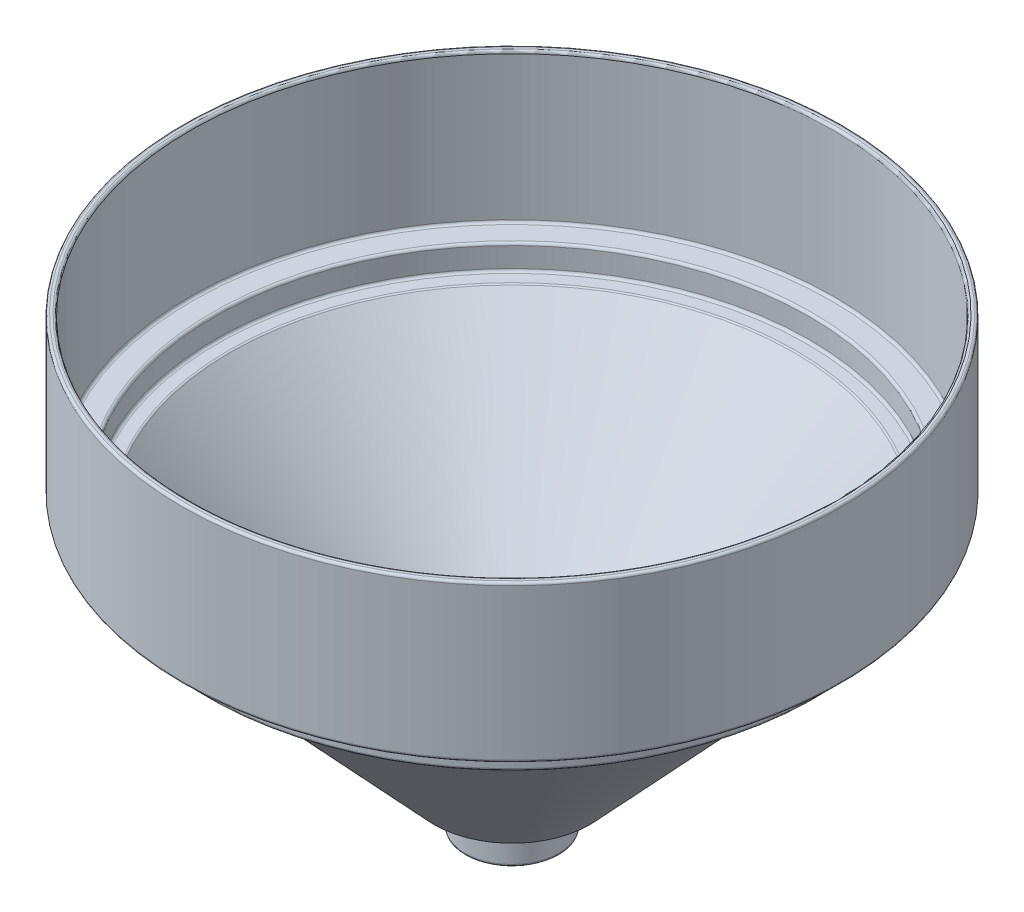
ISO-10303-21;
HEADER;
FILE_DESCRIPTION(('STEP AP214'),'2;1');
FILE_NAME('part.step','',(''),(''),'','','');
FILE_SCHEMA(('AUTOMOTIVE_DESIGN { 1 0 10303 214 1 1 1 1 }'));
ENDSEC;
DATA;
#1=APPLICATION_CONTEXT('core data for automotive mechanical design processes');
#2=APPLICATION_PROTOCOL_DEFINITION('international standard','automotive_design',2000,#1);
#3=PRODUCT_CONTEXT('',#1,'mechanical');
#4=PRODUCT('Part','Part','',(#3));
#5=PRODUCT_RELATED_PRODUCT_CATEGORY('part','',(#4));
#6=PRODUCT_DEFINITION_FORMATION('','',#4);
#7=PRODUCT_DEFINITION_CONTEXT('part definition',#1,'design');
#8=PRODUCT_DEFINITION('design','',#6,#7);
#9=PRODUCT_DEFINITION_SHAPE('','',#8);
#10=(LENGTH_UNIT() NAMED_UNIT(*) SI_UNIT(.MILLI.,.METRE.));
#11=(NAMED_UNIT(*) PLANE_ANGLE_UNIT() SI_UNIT($,.RADIAN.));
#12=(NAMED_UNIT(*) SI_UNIT($,.STERADIAN.) SOLID_ANGLE_UNIT());
#13=UNCERTAINTY_MEASURE_WITH_UNIT(LENGTH_MEASURE(1.E-05),#10,'distance_accuracy_value','');
#14=(GEOMETRIC_REPRESENTATION_CONTEXT(3) GLOBAL_UNCERTAINTY_ASSIGNED_CONTEXT((#13)) GLOBAL_UNIT_ASSIGNED_CONTEXT((#10,
#11,#12)) REPRESENTATION_CONTEXT('',''));
#15=CARTESIAN_POINT('',(0.,0.,0.));
#16=DIRECTION('',(0.,0.,1.));
#17=DIRECTION('',(1.,0.,0.));
#18=AXIS2_PLACEMENT_3D('',#15,#16,#17);
#19=CARTESIAN_POINT('',(0.,0.,0.));
#20=DIRECTION('',(0.,-1.,0.));
#21=DIRECTION('',(0.,0.,-1.));
#22=AXIS2_PLACEMENT_3D('',#19,#20,#21);
#23=CYLINDRICAL_SURFACE('',#22,66.5);
#24=CARTESIAN_POINT('',(0.,79.5,0.));
#25=DIRECTION('',(0.,-1.,0.));
#26=DIRECTION('',(0.,0.,-1.));
#27=AXIS2_PLACEMENT_3D('',#24,#25,#26);
#28=CIRCLE('',#27,66.5);
#29=CARTESIAN_POINT('',(0.,79.5,-66.5000000000003));
#30=VERTEX_POINT('',#29);
#31=EDGE_CURVE('E75',#30,#30,#28,.T.);
#32=ORIENTED_EDGE('',*,*,#31,.T.);
#33=EDGE_LOOP('',(#32));
#34=FACE_BOUND('',#33,.T.);
#35=CARTESIAN_POINT('',(0.,49.,0.));
#36=DIRECTION('',(0.,-1.,0.));
#37=DIRECTION('',(0.,0.,-1.));
#38=AXIS2_PLACEMENT_3D('',#35,#36,#37);
#39=CIRCLE('',#38,66.5);
#40=CARTESIAN_POINT('',(0.,49.,-66.5000000000003));
#41=VERTEX_POINT('',#40);
#42=EDGE_CURVE('E78',#41,#41,#39,.F.);
#43=ORIENTED_EDGE('',*,*,#42,.T.);
#44=EDGE_LOOP('',(#43));
#45=FACE_BOUND('',#44,.T.);
#46=ADVANCED_FACE('F49',(#34,#45),#23,.T.);
#47=CARTESIAN_POINT('',(0.,48.5,-60.));
#48=DIRECTION('',(0.,-1.,0.));
#49=DIRECTION('',(0.,0.,-1.));
#50=AXIS2_PLACEMENT_3D('',#47,#48,#49);
#51=PLANE('',#50);
#52=CARTESIAN_POINT('',(0.,48.5,0.));
#53=DIRECTION('',(0.,-1.,0.));
#54=DIRECTION('',(0.,0.,-1.));
#55=AXIS2_PLACEMENT_3D('',#52,#53,#54);
#56=CIRCLE('',#55,62.);
#57=CARTESIAN_POINT('',(0.,48.5,-62.0000000000002));
#58=VERTEX_POINT('',#57);
#59=EDGE_CURVE('E12',#58,#58,#56,.F.);
#60=ORIENTED_EDGE('',*,*,#59,.T.);
#61=EDGE_LOOP('',(#60));
#62=FACE_BOUND('',#61,.T.);
#63=CARTESIAN_POINT('',(0.,48.5,0.));
#64=DIRECTION('',(0.,-1.,0.));
#65=DIRECTION('',(0.,0.,-1.));
#66=AXIS2_PLACEMENT_3D('',#63,#64,#65);
#67=CIRCLE('',#66,66.);
#68=CARTESIAN_POINT('',(0.,48.5,-66.0000000000003));
#69=VERTEX_POINT('',#68);
#70=EDGE_CURVE('E56',#69,#69,#67,.T.);
#71=ORIENTED_EDGE('',*,*,#70,.T.);
#72=EDGE_LOOP('',(#71));
#73=FACE_BOUND('',#72,.T.);
#74=ADVANCED_FACE('F192',(#62,#73),#51,.T.);
#75=CARTESIAN_POINT('',(0.,0.,0.));
#76=DIRECTION('',(0.,-1.,0.));
#77=DIRECTION('',(0.,0.,-1.));
#78=AXIS2_PLACEMENT_3D('',#75,#76,#77);
#79=CYLINDRICAL_SURFACE('',#78,61.5);
#80=CARTESIAN_POINT('',(0.,48.,0.));
#81=DIRECTION('',(0.,-1.,0.));
#82=DIRECTION('',(0.,0.,-1.));
#83=AXIS2_PLACEMENT_3D('',#80,#81,#82);
#84=CIRCLE('',#83,61.5);
#85=CARTESIAN_POINT('',(0.,48.,-61.5000000000002));
#86=VERTEX_POINT('',#85);
#87=EDGE_CURVE('E60',#86,#86,#84,.T.);
#88=ORIENTED_EDGE('',*,*,#87,.T.);
#89=EDGE_LOOP('',(#88));
#90=FACE_BOUND('',#89,.T.);
#91=CARTESIAN_POINT('',(0.,44.,0.));
#92=DIRECTION('',(0.,-1.,0.));
#93=DIRECTION('',(0.,0.,-1.));
#94=AXIS2_PLACEMENT_3D('',#91,#92,#93);
#95=CIRCLE('',#94,61.5);
#96=CARTESIAN_POINT('',(0.,44.,-61.5000000000002));
#97=VERTEX_POINT('',#96);
#98=EDGE_CURVE('E64',#97,#97,#95,.F.);
#99=ORIENTED_EDGE('',*,*,#98,.T.);
#100=EDGE_LOOP('',(#99));
#101=FACE_BOUND('',#100,.T.);
#102=ADVANCED_FACE('F250',(#90,#101),#79,.T.);
#103=CARTESIAN_POINT('',(0.,43.5,-57.));
#104=DIRECTION('',(0.,-1.,0.));
#105=DIRECTION('',(0.,0.,-1.));
#106=AXIS2_PLACEMENT_3D('',#103,#104,#105);
#107=PLANE('',#106);
#108=CARTESIAN_POINT('',(0.,43.5,0.));
#109=DIRECTION('',(0.,-1.,0.));
#110=DIRECTION('',(0.,0.,-1.));
#111=AXIS2_PLACEMENT_3D('',#108,#109,#110);
#112=CIRCLE('',#111,57.8691046038244);
#113=CARTESIAN_POINT('',(0.,43.5,-57.8691046038247));
#114=VERTEX_POINT('',#113);
#115=EDGE_CURVE('E69',#114,#114,#112,.F.);
#116=ORIENTED_EDGE('',*,*,#115,.T.);
#117=EDGE_LOOP('',(#116));
#118=FACE_BOUND('',#117,.T.);
#119=CARTESIAN_POINT('',(0.,43.5,0.));
#120=DIRECTION('',(0.,-1.,0.));
#121=DIRECTION('',(0.,0.,-1.));
#122=AXIS2_PLACEMENT_3D('',#119,#120,#121);
#123=CIRCLE('',#122,61.);
#124=CARTESIAN_POINT('',(0.,43.5,-61.0000000000002));
#125=VERTEX_POINT('',#124);
#126=EDGE_CURVE('E72',#125,#125,#123,.T.);
#127=ORIENTED_EDGE('',*,*,#126,.T.);
#128=EDGE_LOOP('',(#127));
#129=FACE_BOUND('',#128,.T.);
#130=ADVANCED_FACE('F253',(#118,#129),#107,.T.);
#131=CARTESIAN_POINT('',(0.,-1.5,0.));
#132=DIRECTION('',(0.,1.,0.));
#133=DIRECTION('',(0.,0.,1.));
#134=AXIS2_PLACEMENT_3D('',#131,#132,#133);
#135=CONICAL_SURFACE('',#134,15.6518284528683,0.75092906239794);
#136=CARTESIAN_POINT('',(0.,-1.34115912518001,0.));
#137=DIRECTION('',(0.,-1.,0.));
#138=DIRECTION('',(0.,0.,-1.));
#139=AXIS2_PLACEMENT_3D('',#136,#137,#138);
#140=CIRCLE('',#139,15.8000799360336);
#141=CARTESIAN_POINT('',(0.,-1.34115912518001,15.8000799360337));
#142=VERTEX_POINT('',#141);
#143=EDGE_CURVE('E87',#142,#142,#140,.F.);
#144=CARTESIAN_POINT('',(0.,43.34115912518,0.));
#145=DIRECTION('',(0.,1.,0.));
#146=DIRECTION('',(0.,0.,1.));
#147=AXIS2_PLACEMENT_3D('',#144,#145,#146);
#148=CIRCLE('',#147,57.503576969703);
#149=CARTESIAN_POINT('',(0.,43.34115912518,57.5035769697032));
#150=VERTEX_POINT('',#149);
#151=EDGE_CURVE('E90',#150,#150,#148,.F.);
#152=CARTESIAN_POINT('',(0.,-1.34115912518001,15.8000799360337));
#153=CARTESIAN_POINT('',(0.,-0.875718310072099,16.2344913634678));
#154=CARTESIAN_POINT('',(0.,-0.410277494964182,16.6689027909018));
#155=CARTESIAN_POINT('',(0.,0.520604135251653,17.5377256457699));
#156=CARTESIAN_POINT('',(0.,0.986044950359571,17.972137073204));
#157=CARTESIAN_POINT('',(0.,1.9169265805754,18.8409599280721));
#158=CARTESIAN_POINT('',(0.,2.38236739568332,19.2753713555062));
#159=CARTESIAN_POINT('',(0.,3.31324902589915,20.1441942103743));
#160=CARTESIAN_POINT('',(0.,3.77868984100707,20.5786056378083));
#161=CARTESIAN_POINT('',(0.,4.7095714712229,21.4474284926764));
#162=CARTESIAN_POINT('',(0.,5.17501228633082,21.8818399201105));
#163=CARTESIAN_POINT('',(0.,6.10589391654665,22.7506627749786));
#164=CARTESIAN_POINT('',(0.,6.57133473165457,23.1850742024127));
#165=CARTESIAN_POINT('',(0.,7.50221636187041,24.0538970572808));
#166=CARTESIAN_POINT('',(0.,7.96765717697832,24.4883084847149));
#167=CARTESIAN_POINT('',(0.,8.89853880719416,25.357131339583));
#168=CARTESIAN_POINT('',(0.,9.36397962230207,25.791542767017));
#169=CARTESIAN_POINT('',(0.,10.2948612525179,26.6603656218851));
#170=CARTESIAN_POINT('',(0.,10.7603020676258,27.0947770493192));
#171=CARTESIAN_POINT('',(0.,11.6911836978417,27.9635999041873));
#172=CARTESIAN_POINT('',(0.,12.1566245129496,28.3980113316214));
#173=CARTESIAN_POINT('',(0.,13.0875061431654,29.2668341864895));
#174=CARTESIAN_POINT('',(0.,13.5529469582733,29.7012456139235));
#175=CARTESIAN_POINT('',(0.,14.4838285884892,30.5700684687917));
#176=CARTESIAN_POINT('',(0.,14.9492694035971,31.0044798962257));
#177=CARTESIAN_POINT('',(0.,15.8801510338129,31.8733027510938));
#178=CARTESIAN_POINT('',(0.,16.3455918489208,32.3077141785279));
#179=CARTESIAN_POINT('',(0.,17.2764734791367,33.176537033396));
#180=CARTESIAN_POINT('',(0.,17.7419142942446,33.6109484608301));
#181=CARTESIAN_POINT('',(0.,18.6727959244604,34.4797713156982));
#182=CARTESIAN_POINT('',(0.,19.1382367395683,34.9141827431322));
#183=CARTESIAN_POINT('',(0.,20.0691183697842,35.7830055980003));
#184=CARTESIAN_POINT('',(0.,20.5345591848921,36.2174170254344));
#185=CARTESIAN_POINT('',(0.,21.4654408151079,37.0862398803025));
#186=CARTESIAN_POINT('',(0.,21.9308816302158,37.5206513077366));
#187=CARTESIAN_POINT('',(0.,22.8617632604317,38.3894741626047));
#188=CARTESIAN_POINT('',(0.,23.3272040755396,38.8238855900387));
#189=CARTESIAN_POINT('',(0.,24.2580857057554,39.6927084449069));
#190=CARTESIAN_POINT('',(0.,24.7235265208633,40.1271198723409));
#191=CARTESIAN_POINT('',(0.,25.6544081510792,40.995942727209));
#192=CARTESIAN_POINT('',(0.,26.1198489661871,41.4303541546431));
#193=CARTESIAN_POINT('',(0.,27.0507305964029,42.2991770095112));
#194=CARTESIAN_POINT('',(0.,27.5161714115108,42.7335884369453));
#195=CARTESIAN_POINT('',(0.,28.4470530417267,43.6024112918134));
#196=CARTESIAN_POINT('',(0.,28.9124938568346,44.0368227192474));
#197=CARTESIAN_POINT('',(0.,29.8433754870504,44.9056455741155));
#198=CARTESIAN_POINT('',(0.,30.3088163021583,45.3400570015496));
#199=CARTESIAN_POINT('',(0.,31.2396979323742,46.2088798564177));
#200=CARTESIAN_POINT('',(0.,31.7051387474821,46.6432912838518));
#201=CARTESIAN_POINT('',(0.,32.6360203776979,47.5121141387199));
#202=CARTESIAN_POINT('',(0.,33.1014611928058,47.9465255661539));
#203=CARTESIAN_POINT('',(0.,34.0323428230217,48.8153484210221));
#204=CARTESIAN_POINT('',(0.,34.4977836381296,49.2497598484561));
#205=CARTESIAN_POINT('',(0.,35.4286652683454,50.1185827033242));
#206=CARTESIAN_POINT('',(0.,35.8941060834533,50.5529941307583));
#207=CARTESIAN_POINT('',(0.,36.8249877136692,51.4218169856264));
#208=CARTESIAN_POINT('',(0.,37.2904285287771,51.8562284130605));
#209=CARTESIAN_POINT('',(0.,38.2213101589929,52.7250512679286));
#210=CARTESIAN_POINT('',(0.,38.6867509741008,53.1594626953626));
#211=CARTESIAN_POINT('',(0.,39.6176326043167,54.0282855502308));
#212=CARTESIAN_POINT('',(0.,40.0830734194246,54.4626969776648));
#213=CARTESIAN_POINT('',(0.,41.0139550496404,55.3315198325329));
#214=CARTESIAN_POINT('',(0.,41.4793958647483,55.765931259967));
#215=CARTESIAN_POINT('',(0.,42.4102774949642,56.6347541148351));
#216=CARTESIAN_POINT('',(0.,42.8757183100721,57.0691655422691));
#217=CARTESIAN_POINT('',(0.,43.34115912518,57.5035769697032));
#218=B_SPLINE_CURVE_WITH_KNOTS('',3,(#152,#153,#154,#155,#156,#157,#158,#159,#160,#161,#162,
#163,#164,#165,#166,#167,#168,#169,#170,#171,#172,#173,#174,#175,#176,#177,#178,#179,#180,#181,
#182,#183,#184,#185,#186,#187,#188,#189,#190,#191,#192,#193,#194,#195,#196,#197,#198,#199,#200,
#201,#202,#203,#204,#205,#206,#207,#208,#209,#210,#211,#212,#213,#214,#215,#216,#217),
.UNSPECIFIED.,.F.,.F.,(4,2,2,2,2,2,2,2,2,2,2,2,2,2,2,2,2,2,2,2,2,2,2,2,2,2,2,2,2,2,2,2,4),(0.,
1.9100094151293,3.82001883025859,5.73002824538789,7.64003766051718,9.55004707564648,
11.4600564907758,13.3700659059051,15.2800753210344,17.1900847361637,19.100094151293,
21.0101035664223,22.9201129815515,24.8301223966808,26.7401318118101,28.6501412269394,
30.5601506420687,32.470160057198,34.3801694723273,36.2901788874566,38.2001883025859,
40.1101977177152,42.0202071328445,43.9302165479738,45.8402259631031,47.7502353782324,
49.6602447933617,51.570254208491,53.4802636236203,55.3902730387496,57.3002824538789,
59.2102918690082,61.1203012841375),.UNSPECIFIED.);
#219=EDGE_CURVE('BSEAM257',#142,#150,#218,.T.);
#220=ORIENTED_EDGE('',*,*,#143,.T.);
#221=ORIENTED_EDGE('',*,*,#151,.T.);
#222=ORIENTED_EDGE('',*,*,#219,.T.);
#223=ORIENTED_EDGE('',*,*,#219,.F.);
#224=EDGE_LOOP('',(#220,#222,#221,#223));
#225=FACE_BOUND('',#224,.T.);
#226=ADVANCED_FACE('F257',(#225),#135,.T.);
#227=CARTESIAN_POINT('',(0.,-1.5,-8.00000000000001));
#228=DIRECTION('',(0.,-1.,0.));
#229=DIRECTION('',(0.,0.,-1.));
#230=AXIS2_PLACEMENT_3D('',#227,#228,#229);
#231=PLANE('',#230);
#232=CARTESIAN_POINT('',(0.,-1.5,0.));
#233=DIRECTION('',(0.,-1.,0.));
#234=DIRECTION('',(0.,0.,-1.));
#235=AXIS2_PLACEMENT_3D('',#232,#233,#234);
#236=CIRCLE('',#235,10.);
#237=CARTESIAN_POINT('',(0.,-1.5,-10.));
#238=VERTEX_POINT('',#237);
#239=EDGE_CURVE('E93',#238,#238,#236,.F.);
#240=ORIENTED_EDGE('',*,*,#239,.T.);
#241=EDGE_LOOP('',(#240));
#242=FACE_BOUND('',#241,.T.);
#243=CARTESIAN_POINT('',(0.,-1.5,0.));
#244=DIRECTION('',(0.,-1.,0.));
#245=DIRECTION('',(0.,0.,-1.));
#246=AXIS2_PLACEMENT_3D('',#243,#244,#245);
#247=CIRCLE('',#246,15.4345523019122);
#248=CARTESIAN_POINT('',(0.,-1.5,-15.4345523019123));
#249=VERTEX_POINT('',#248);
#250=EDGE_CURVE('E96',#249,#249,#247,.T.);
#251=ORIENTED_EDGE('',*,*,#250,.T.);
#252=EDGE_LOOP('',(#251));
#253=FACE_BOUND('',#252,.T.);
#254=ADVANCED_FACE('F261',(#242,#253),#231,.T.);
#255=CARTESIAN_POINT('',(0.,0.,0.));
#256=DIRECTION('',(0.,-1.,0.));
#257=DIRECTION('',(0.,0.,-1.));
#258=AXIS2_PLACEMENT_3D('',#255,#256,#257);
#259=CYLINDRICAL_SURFACE('',#258,9.5);
#260=CARTESIAN_POINT('',(0.,-9.50000000000001,0.));
#261=DIRECTION('',(0.,1.,0.));
#262=DIRECTION('',(0.,0.,1.));
#263=AXIS2_PLACEMENT_3D('',#260,#261,#262);
#264=CIRCLE('',#263,9.5);
#265=CARTESIAN_POINT('',(0.,-9.50000000000001,9.50000000000004));
#266=VERTEX_POINT('',#265);
#267=EDGE_CURVE('E99',#266,#266,#264,.T.);
#268=ORIENTED_EDGE('',*,*,#267,.T.);
#269=EDGE_LOOP('',(#268));
#270=FACE_BOUND('',#269,.T.);
#271=CARTESIAN_POINT('',(0.,-2.,0.));
#272=DIRECTION('',(0.,-1.,0.));
#273=DIRECTION('',(0.,0.,-1.));
#274=AXIS2_PLACEMENT_3D('',#271,#272,#273);
#275=CIRCLE('',#274,9.5);
#276=CARTESIAN_POINT('',(0.,-2.,-9.50000000000004));
#277=VERTEX_POINT('',#276);
#278=EDGE_CURVE('E102',#277,#277,#275,.T.);
#279=ORIENTED_EDGE('',*,*,#278,.T.);
#280=EDGE_LOOP('',(#279));
#281=FACE_BOUND('',#280,.T.);
#282=ADVANCED_FACE('F265',(#270,#281),#259,.T.);
#283=CARTESIAN_POINT('',(0.,-10.,-9.50000000000001));
#284=DIRECTION('',(0.,1.,0.));
#285=DIRECTION('',(0.,0.,1.));
#286=AXIS2_PLACEMENT_3D('',#283,#284,#285);
#287=PLANE('',#286);
#288=CARTESIAN_POINT('',(0.,-10.,0.));
#289=DIRECTION('',(0.,1.,0.));
#290=DIRECTION('',(0.,0.,1.));
#291=AXIS2_PLACEMENT_3D('',#288,#289,#290);
#292=CIRCLE('',#291,9.);
#293=CARTESIAN_POINT('',(0.,-10.,9.00000000000004));
#294=VERTEX_POINT('',#293);
#295=EDGE_CURVE('E105',#294,#294,#292,.F.);
#296=ORIENTED_EDGE('',*,*,#295,.T.);
#297=EDGE_LOOP('',(#296));
#298=FACE_BOUND('',#297,.T.);
#299=CARTESIAN_POINT('',(0.,-10.,0.));
#300=DIRECTION('',(0.,1.,0.));
#301=DIRECTION('',(0.,0.,1.));
#302=AXIS2_PLACEMENT_3D('',#299,#300,#301);
#303=CIRCLE('',#302,8.5);
#304=CARTESIAN_POINT('',(0.,-10.,8.50000000000004));
#305=VERTEX_POINT('',#304);
#306=EDGE_CURVE('E108',#305,#305,#303,.T.);
#307=ORIENTED_EDGE('',*,*,#306,.T.);
#308=EDGE_LOOP('',(#307));
#309=FACE_BOUND('',#308,.T.);
#310=ADVANCED_FACE('F269',(#298,#309),#287,.F.);
#311=CARTESIAN_POINT('',(0.,0.,0.));
#312=DIRECTION('',(0.,-1.,0.));
#313=DIRECTION('',(0.,0.,-1.));
#314=AXIS2_PLACEMENT_3D('',#311,#312,#313);
#315=CYLINDRICAL_SURFACE('',#314,8.);
#316=CARTESIAN_POINT('',(0.,-0.5,0.));
#317=DIRECTION('',(0.,-1.,0.));
#318=DIRECTION('',(0.,0.,-1.));
#319=AXIS2_PLACEMENT_3D('',#316,#317,#318);
#320=CIRCLE('',#319,8.);
#321=CARTESIAN_POINT('',(0.,-0.5,-8.00000000000003));
#322=VERTEX_POINT('',#321);
#323=EDGE_CURVE('E111',#322,#322,#320,.F.);
#324=ORIENTED_EDGE('',*,*,#323,.T.);
#325=EDGE_LOOP('',(#324));
#326=FACE_BOUND('',#325,.T.);
#327=CARTESIAN_POINT('',(0.,-9.50000000000001,0.));
#328=DIRECTION('',(0.,1.,0.));
#329=DIRECTION('',(0.,0.,1.));
#330=AXIS2_PLACEMENT_3D('',#327,#328,#329);
#331=CIRCLE('',#330,8.);
#332=CARTESIAN_POINT('',(0.,-9.50000000000001,8.00000000000003));
#333=VERTEX_POINT('',#332);
#334=EDGE_CURVE('E114',#333,#333,#331,.F.);
#335=ORIENTED_EDGE('',*,*,#334,.T.);
#336=EDGE_LOOP('',(#335));
#337=FACE_BOUND('',#336,.T.);
#338=ADVANCED_FACE('F273',(#326,#337),#315,.F.);
#339=CARTESIAN_POINT('',(0.,0.,-8.00000000000001));
#340=DIRECTION('',(0.,-1.,0.));
#341=DIRECTION('',(0.,0.,-1.));
#342=AXIS2_PLACEMENT_3D('',#339,#340,#341);
#343=PLANE('',#342);
#344=CARTESIAN_POINT('',(0.,0.,0.));
#345=DIRECTION('',(0.,-1.,0.));
#346=DIRECTION('',(0.,0.,-1.));
#347=AXIS2_PLACEMENT_3D('',#344,#345,#346);
#348=CIRCLE('',#347,8.5);
#349=CARTESIAN_POINT('',(0.,0.,-8.50000000000004));
#350=VERTEX_POINT('',#349);
#351=EDGE_CURVE('E117',#350,#350,#348,.T.);
#352=ORIENTED_EDGE('',*,*,#351,.T.);
#353=EDGE_LOOP('',(#352));
#354=FACE_BOUND('',#353,.T.);
#355=CARTESIAN_POINT('',(0.,0.,0.));
#356=DIRECTION('',(0.,-1.,0.));
#357=DIRECTION('',(0.,0.,-1.));
#358=AXIS2_PLACEMENT_3D('',#355,#356,#357);
#359=CIRCLE('',#358,14.7827238490439);
#360=CARTESIAN_POINT('',(0.,0.,-14.782723849044));
#361=VERTEX_POINT('',#360);
#362=EDGE_CURVE('E120',#361,#361,#359,.F.);
#363=ORIENTED_EDGE('',*,*,#362,.T.);
#364=EDGE_LOOP('',(#363));
#365=FACE_BOUND('',#364,.T.);
#366=ADVANCED_FACE('F277',(#354,#365),#343,.F.);
#367=CARTESIAN_POINT('',(0.,0.,0.));
#368=DIRECTION('',(0.,1.,0.));
#369=DIRECTION('',(0.,0.,1.));
#370=AXIS2_PLACEMENT_3D('',#367,#368,#369);
#371=CONICAL_SURFACE('',#370,15.,0.75092906239794);
#372=CARTESIAN_POINT('',(0.,44.84115912518,0.));
#373=DIRECTION('',(0.,-1.,0.));
#374=DIRECTION('',(0.,0.,-1.));
#375=AXIS2_PLACEMENT_3D('',#372,#373,#374);
#376=CIRCLE('',#375,56.8517485168347);
#377=CARTESIAN_POINT('',(0.,44.84115912518,56.8517485168349));
#378=VERTEX_POINT('',#377);
#379=EDGE_CURVE('E123',#378,#378,#376,.F.);
#380=CARTESIAN_POINT('',(0.,0.158840874819988,0.));
#381=DIRECTION('',(0.,1.,0.));
#382=DIRECTION('',(0.,0.,1.));
#383=AXIS2_PLACEMENT_3D('',#380,#381,#382);
#384=CIRCLE('',#383,15.1482514831653);
#385=CARTESIAN_POINT('',(0.,0.158840874819988,15.1482514831654));
#386=VERTEX_POINT('',#385);
#387=EDGE_CURVE('E126',#386,#386,#384,.F.);
#388=CARTESIAN_POINT('',(0.,44.84115912518,56.8517485168349));
#389=CARTESIAN_POINT('',(0.,44.3757183100721,56.4173370894008));
#390=CARTESIAN_POINT('',(0.,43.9102774949642,55.9829256619668));
#391=CARTESIAN_POINT('',(0.,42.9793958647483,55.1141028070987));
#392=CARTESIAN_POINT('',(0.,42.5139550496404,54.6796913796646));
#393=CARTESIAN_POINT('',(0.,41.5830734194246,53.8108685247965));
#394=CARTESIAN_POINT('',(0.,41.1176326043167,53.3764570973624));
#395=CARTESIAN_POINT('',(0.,40.1867509741008,52.5076342424943));
#396=CARTESIAN_POINT('',(0.,39.7213101589929,52.0732228150603));
#397=CARTESIAN_POINT('',(0.,38.7904285287771,51.2043999601921));
#398=CARTESIAN_POINT('',(0.,38.3249877136692,50.7699885327581));
#399=CARTESIAN_POINT('',(0.,37.3941060834533,49.90116567789));
#400=CARTESIAN_POINT('',(0.,36.9286652683454,49.4667542504559));
#401=CARTESIAN_POINT('',(0.,35.9977836381296,48.5979313955878));
#402=CARTESIAN_POINT('',(0.,35.5323428230217,48.1635199681537));
#403=CARTESIAN_POINT('',(0.,34.6014611928058,47.2946971132856));
#404=CARTESIAN_POINT('',(0.,34.1360203776979,46.8602856858516));
#405=CARTESIAN_POINT('',(0.,33.2051387474821,45.9914628309835));
#406=CARTESIAN_POINT('',(0.,32.7396979323742,45.5570514035494));
#407=CARTESIAN_POINT('',(0.,31.8088163021583,44.6882285486813));
#408=CARTESIAN_POINT('',(0.,31.3433754870504,44.2538171212472));
#409=CARTESIAN_POINT('',(0.,30.4124938568346,43.3849942663791));
#410=CARTESIAN_POINT('',(0.,29.9470530417267,42.950582838945));
#411=CARTESIAN_POINT('',(0.,29.0161714115108,42.0817599840769));
#412=CARTESIAN_POINT('',(0.,28.5507305964029,41.6473485566429));
#413=CARTESIAN_POINT('',(0.,27.6198489661871,40.7785257017748));
#414=CARTESIAN_POINT('',(0.,27.1544081510792,40.3441142743407));
#415=CARTESIAN_POINT('',(0.,26.2235265208633,39.4752914194726));
#416=CARTESIAN_POINT('',(0.,25.7580857057554,39.0408799920385));
#417=CARTESIAN_POINT('',(0.,24.8272040755396,38.1720571371704));
#418=CARTESIAN_POINT('',(0.,24.3617632604317,37.7376457097364));
#419=CARTESIAN_POINT('',(0.,23.4308816302158,36.8688228548682));
#420=CARTESIAN_POINT('',(0.,22.9654408151079,36.4344114274342));
#421=CARTESIAN_POINT('',(0.,22.0345591848921,35.5655885725661));
#422=CARTESIAN_POINT('',(0.,21.5691183697842,35.131177145132));
#423=CARTESIAN_POINT('',(0.,20.6382367395683,34.2623542902639));
#424=CARTESIAN_POINT('',(0.,20.1727959244604,33.8279428628298));
#425=CARTESIAN_POINT('',(0.,19.2419142942446,32.9591200079617));
#426=CARTESIAN_POINT('',(0.,18.7764734791367,32.5247085805277));
#427=CARTESIAN_POINT('',(0.,17.8455918489208,31.6558857256596));
#428=CARTESIAN_POINT('',(0.,17.3801510338129,31.2214742982255));
#429=CARTESIAN_POINT('',(0.,16.4492694035971,30.3526514433574));
#430=CARTESIAN_POINT('',(0.,15.9838285884892,29.9182400159233));
#431=CARTESIAN_POINT('',(0.,15.0529469582733,29.0494171610552));
#432=CARTESIAN_POINT('',(0.,14.5875061431654,28.6150057336212));
#433=CARTESIAN_POINT('',(0.,13.6566245129496,27.746182878753));
#434=CARTESIAN_POINT('',(0.,13.1911836978417,27.311771451319));
#435=CARTESIAN_POINT('',(0.,12.2603020676258,26.4429485964509));
#436=CARTESIAN_POINT('',(0.,11.7948612525179,26.0085371690168));
#437=CARTESIAN_POINT('',(0.,10.8639796223021,25.1397143141487));
#438=CARTESIAN_POINT('',(0.,10.3985388071942,24.7053028867146));
#439=CARTESIAN_POINT('',(0.,9.46765717697832,23.8364800318465));
#440=CARTESIAN_POINT('',(0.,9.00221636187041,23.4020686044125));
#441=CARTESIAN_POINT('',(0.,8.07133473165458,22.5332457495444));
#442=CARTESIAN_POINT('',(0.,7.60589391654666,22.0988343221103));
#443=CARTESIAN_POINT('',(0.,6.67501228633082,21.2300114672422));
#444=CARTESIAN_POINT('',(0.,6.2095714712229,20.7956000398081));
#445=CARTESIAN_POINT('',(0.,5.27868984100707,19.92677718494));
#446=CARTESIAN_POINT('',(0.,4.81324902589916,19.492365757506));
#447=CARTESIAN_POINT('',(0.,3.88236739568332,18.6235429026378));
#448=CARTESIAN_POINT('',(0.,3.4169265805754,18.1891314752038));
#449=CARTESIAN_POINT('',(0.,2.48604495035957,17.3203086203357));
#450=CARTESIAN_POINT('',(0.,2.02060413525165,16.8858971929016));
#451=CARTESIAN_POINT('',(0.,1.08972250503582,16.0170743380335));
#452=CARTESIAN_POINT('',(0.,0.624281689927903,15.5826629105994));
#453=CARTESIAN_POINT('',(0.,0.158840874819988,15.1482514831654));
#454=B_SPLINE_CURVE_WITH_KNOTS('',3,(#388,#389,#390,#391,#392,#393,#394,#395,#396,#397,#398,
#399,#400,#401,#402,#403,#404,#405,#406,#407,#408,#409,#410,#411,#412,#413,#414,#415,#416,#417,
#418,#419,#420,#421,#422,#423,#424,#425,#426,#427,#428,#429,#430,#431,#432,#433,#434,#435,#436,
#437,#438,#439,#440,#441,#442,#443,#444,#445,#446,#447,#448,#449,#450,#451,#452,#453),
.UNSPECIFIED.,.F.,.F.,(4,2,2,2,2,2,2,2,2,2,2,2,2,2,2,2,2,2,2,2,2,2,2,2,2,2,2,2,2,2,2,2,4),(0.,
1.9100094151293,3.82001883025859,5.7300282453879,7.64003766051718,9.55004707564648,
11.4600564907758,13.3700659059051,15.2800753210344,17.1900847361637,19.100094151293,
21.0101035664223,22.9201129815516,24.8301223966808,26.7401318118101,28.6501412269394,
30.5601506420687,32.470160057198,34.3801694723273,36.2901788874566,38.2001883025859,
40.1101977177152,42.0202071328445,43.9302165479738,45.8402259631031,47.7502353782324,
49.6602447933617,51.570254208491,53.4802636236203,55.3902730387496,57.3002824538789,
59.2102918690082,61.1203012841375),.UNSPECIFIED.);
#455=EDGE_CURVE('BSEAM281',#378,#386,#454,.T.);
#456=ORIENTED_EDGE('',*,*,#379,.T.);
#457=ORIENTED_EDGE('',*,*,#387,.T.);
#458=ORIENTED_EDGE('',*,*,#455,.T.);
#459=ORIENTED_EDGE('',*,*,#455,.F.);
#460=EDGE_LOOP('',(#456,#458,#457,#459));
#461=FACE_BOUND('',#460,.T.);
#462=ADVANCED_FACE('F281',(#461),#371,.F.);
#463=CARTESIAN_POINT('',(0.,45.,-57.));
#464=DIRECTION('',(0.,-1.,0.));
#465=DIRECTION('',(0.,0.,-1.));
#466=AXIS2_PLACEMENT_3D('',#463,#464,#465);
#467=PLANE('',#466);
#468=CARTESIAN_POINT('',(0.,45.,0.));
#469=DIRECTION('',(0.,-1.,0.));
#470=DIRECTION('',(0.,0.,-1.));
#471=AXIS2_PLACEMENT_3D('',#468,#469,#470);
#472=CIRCLE('',#471,59.5);
#473=CARTESIAN_POINT('',(0.,45.,-59.5000000000002));
#474=VERTEX_POINT('',#473);
#475=EDGE_CURVE('E129',#474,#474,#472,.F.);
#476=ORIENTED_EDGE('',*,*,#475,.T.);
#477=EDGE_LOOP('',(#476));
#478=FACE_BOUND('',#477,.T.);
#479=CARTESIAN_POINT('',(0.,45.,0.));
#480=DIRECTION('',(0.,-1.,0.));
#481=DIRECTION('',(0.,0.,-1.));
#482=AXIS2_PLACEMENT_3D('',#479,#480,#481);
#483=CIRCLE('',#482,57.2172761509561);
#484=CARTESIAN_POINT('',(0.,45.,-57.2172761509563));
#485=VERTEX_POINT('',#484);
#486=EDGE_CURVE('E132',#485,#485,#483,.T.);
#487=ORIENTED_EDGE('',*,*,#486,.T.);
#488=EDGE_LOOP('',(#487));
#489=FACE_BOUND('',#488,.T.);
#490=ADVANCED_FACE('F285',(#478,#489),#467,.F.);
#491=CARTESIAN_POINT('',(0.,0.,0.));
#492=DIRECTION('',(0.,-1.,0.));
#493=DIRECTION('',(0.,0.,-1.));
#494=AXIS2_PLACEMENT_3D('',#491,#492,#493);
#495=CYLINDRICAL_SURFACE('',#494,60.);
#496=CARTESIAN_POINT('',(0.,49.5,0.));
#497=DIRECTION('',(0.,-1.,0.));
#498=DIRECTION('',(0.,0.,-1.));
#499=AXIS2_PLACEMENT_3D('',#496,#497,#498);
#500=CIRCLE('',#499,60.);
#501=CARTESIAN_POINT('',(0.,49.5,-60.0000000000002));
#502=VERTEX_POINT('',#501);
#503=EDGE_CURVE('E141',#502,#502,#500,.F.);
#504=ORIENTED_EDGE('',*,*,#503,.T.);
#505=EDGE_LOOP('',(#504));
#506=FACE_BOUND('',#505,.T.);
#507=CARTESIAN_POINT('',(0.,45.5,0.));
#508=DIRECTION('',(0.,-1.,0.));
#509=DIRECTION('',(0.,0.,-1.));
#510=AXIS2_PLACEMENT_3D('',#507,#508,#509);
#511=CIRCLE('',#510,60.);
#512=CARTESIAN_POINT('',(0.,45.5,-60.0000000000002));
#513=VERTEX_POINT('',#512);
#514=EDGE_CURVE('E144',#513,#513,#511,.T.);
#515=ORIENTED_EDGE('',*,*,#514,.T.);
#516=EDGE_LOOP('',(#515));
#517=FACE_BOUND('',#516,.T.);
#518=ADVANCED_FACE('F289',(#506,#517),#495,.F.);
#519=CARTESIAN_POINT('',(0.,50.,-60.));
#520=DIRECTION('',(0.,-1.,0.));
#521=DIRECTION('',(0.,0.,-1.));
#522=AXIS2_PLACEMENT_3D('',#519,#520,#521);
#523=PLANE('',#522);
#524=CARTESIAN_POINT('',(0.,50.,0.));
#525=DIRECTION('',(0.,-1.,0.));
#526=DIRECTION('',(0.,0.,-1.));
#527=AXIS2_PLACEMENT_3D('',#524,#525,#526);
#528=CIRCLE('',#527,60.5);
#529=CARTESIAN_POINT('',(0.,50.,-60.5000000000002));
#530=VERTEX_POINT('',#529);
#531=EDGE_CURVE('E147',#530,#530,#528,.T.);
#532=ORIENTED_EDGE('',*,*,#531,.T.);
#533=EDGE_LOOP('',(#532));
#534=FACE_BOUND('',#533,.T.);
#535=CARTESIAN_POINT('',(0.,50.,0.));
#536=DIRECTION('',(0.,-1.,0.));
#537=DIRECTION('',(0.,0.,-1.));
#538=AXIS2_PLACEMENT_3D('',#535,#536,#537);
#539=CIRCLE('',#538,64.5);
#540=CARTESIAN_POINT('',(0.,50.,-64.5000000000003));
#541=VERTEX_POINT('',#540);
#542=EDGE_CURVE('E150',#541,#541,#539,.F.);
#543=ORIENTED_EDGE('',*,*,#542,.T.);
#544=EDGE_LOOP('',(#543));
#545=FACE_BOUND('',#544,.T.);
#546=ADVANCED_FACE('F154',(#534,#545),#523,.F.);
#547=CARTESIAN_POINT('',(0.,0.,0.));
#548=DIRECTION('',(0.,-1.,0.));
#549=DIRECTION('',(0.,0.,-1.));
#550=AXIS2_PLACEMENT_3D('',#547,#548,#549);
#551=CYLINDRICAL_SURFACE('',#550,65.);
#552=CARTESIAN_POINT('',(0.,50.5,0.));
#553=DIRECTION('',(0.,-1.,0.));
#554=DIRECTION('',(0.,0.,-1.));
#555=AXIS2_PLACEMENT_3D('',#552,#553,#554);
#556=CIRCLE('',#555,65.);
#557=CARTESIAN_POINT('',(0.,50.5,-65.0000000000003));
#558=VERTEX_POINT('',#557);
#559=EDGE_CURVE('E135',#558,#558,#556,.T.);
#560=ORIENTED_EDGE('',*,*,#559,.T.);
#561=EDGE_LOOP('',(#560));
#562=FACE_BOUND('',#561,.T.);
#563=CARTESIAN_POINT('',(0.,79.5,0.));
#564=DIRECTION('',(0.,-1.,0.));
#565=DIRECTION('',(0.,0.,-1.));
#566=AXIS2_PLACEMENT_3D('',#563,#564,#565);
#567=CIRCLE('',#566,65.);
#568=CARTESIAN_POINT('',(0.,79.5,-65.0000000000003));
#569=VERTEX_POINT('',#568);
#570=EDGE_CURVE('E138',#569,#569,#567,.F.);
#571=ORIENTED_EDGE('',*,*,#570,.T.);
#572=EDGE_LOOP('',(#571));
#573=FACE_BOUND('',#572,.T.);
#574=ADVANCED_FACE('F164',(#562,#573),#551,.F.);
#575=CARTESIAN_POINT('',(0.,80.,-65.0000000000002));
#576=DIRECTION('',(0.,-1.,0.));
#577=DIRECTION('',(0.,0.,-1.));
#578=AXIS2_PLACEMENT_3D('',#575,#576,#577);
#579=PLANE('',#578);
#580=CARTESIAN_POINT('',(0.,80.,0.));
#581=DIRECTION('',(0.,-1.,0.));
#582=DIRECTION('',(0.,0.,-1.));
#583=AXIS2_PLACEMENT_3D('',#580,#581,#582);
#584=CIRCLE('',#583,65.5);
#585=CARTESIAN_POINT('',(0.,80.,-65.5000000000003));
#586=VERTEX_POINT('',#585);
#587=EDGE_CURVE('E81',#586,#586,#584,.T.);
#588=ORIENTED_EDGE('',*,*,#587,.T.);
#589=EDGE_LOOP('',(#588));
#590=FACE_BOUND('',#589,.T.);
#591=CARTESIAN_POINT('',(0.,80.,0.));
#592=DIRECTION('',(0.,-1.,0.));
#593=DIRECTION('',(0.,0.,-1.));
#594=AXIS2_PLACEMENT_3D('',#591,#592,#593);
#595=CIRCLE('',#594,66.);
#596=CARTESIAN_POINT('',(0.,80.,-66.0000000000003));
#597=VERTEX_POINT('',#596);
#598=EDGE_CURVE('E84',#597,#597,#595,.F.);
#599=ORIENTED_EDGE('',*,*,#598,.T.);
#600=EDGE_LOOP('',(#599));
#601=FACE_BOUND('',#600,.T.);
#602=ADVANCED_FACE('F167',(#590,#601),#579,.F.);
#603=CARTESIAN_POINT('',(0.,49.5,0.));
#604=DIRECTION('',(0.,-1.,0.));
#605=DIRECTION('',(0.,0.,-1.));
#606=AXIS2_PLACEMENT_3D('',#603,#604,#605);
#607=TOROIDAL_SURFACE('',#606,60.5,0.5);
#608=ORIENTED_EDGE('',*,*,#503,.F.);
#609=EDGE_LOOP('',(#608));
#610=FACE_BOUND('',#609,.T.);
#611=ORIENTED_EDGE('',*,*,#531,.F.);
#612=EDGE_LOOP('',(#611));
#613=FACE_BOUND('',#612,.T.);
#614=ADVANCED_FACE('F160',(#610,#613),#607,.T.);
#615=CARTESIAN_POINT('',(0.,50.5,0.));
#616=DIRECTION('',(0.,-1.,0.));
#617=DIRECTION('',(0.,0.,-1.));
#618=AXIS2_PLACEMENT_3D('',#615,#616,#617);
#619=TOROIDAL_SURFACE('',#618,64.5,0.5);
#620=ORIENTED_EDGE('',*,*,#542,.F.);
#621=EDGE_LOOP('',(#620));
#622=FACE_BOUND('',#621,.T.);
#623=ORIENTED_EDGE('',*,*,#559,.F.);
#624=EDGE_LOOP('',(#623));
#625=FACE_BOUND('',#624,.T.);
#626=ADVANCED_FACE('F156',(#622,#625),#619,.F.);
#627=CARTESIAN_POINT('',(0.,45.5,0.));
#628=DIRECTION('',(0.,-1.,0.));
#629=DIRECTION('',(0.,0.,-1.));
#630=AXIS2_PLACEMENT_3D('',#627,#628,#629);
#631=TOROIDAL_SURFACE('',#630,59.5,0.5);
#632=ORIENTED_EDGE('',*,*,#475,.F.);
#633=EDGE_LOOP('',(#632));
#634=FACE_BOUND('',#633,.T.);
#635=ORIENTED_EDGE('',*,*,#514,.F.);
#636=EDGE_LOOP('',(#635));
#637=FACE_BOUND('',#636,.T.);
#638=ADVANCED_FACE('F159',(#634,#637),#631,.F.);
#639=CARTESIAN_POINT('',(0.,44.5,0.));
#640=DIRECTION('',(0.,-1.,0.));
#641=DIRECTION('',(0.,0.,-1.));
#642=AXIS2_PLACEMENT_3D('',#639,#640,#641);
#643=TOROIDAL_SURFACE('',#642,57.2172761509561,0.5);
#644=ORIENTED_EDGE('',*,*,#379,.F.);
#645=EDGE_LOOP('',(#644));
#646=FACE_BOUND('',#645,.T.);
#647=ORIENTED_EDGE('',*,*,#486,.F.);
#648=EDGE_LOOP('',(#647));
#649=FACE_BOUND('',#648,.T.);
#650=ADVANCED_FACE('F237',(#646,#649),#643,.T.);
#651=CARTESIAN_POINT('',(0.,-0.5,0.));
#652=DIRECTION('',(0.,-1.,0.));
#653=DIRECTION('',(0.,0.,-1.));
#654=AXIS2_PLACEMENT_3D('',#651,#652,#653);
#655=TOROIDAL_SURFACE('',#654,8.5,0.5);
#656=ORIENTED_EDGE('',*,*,#323,.F.);
#657=EDGE_LOOP('',(#656));
#658=FACE_BOUND('',#657,.T.);
#659=ORIENTED_EDGE('',*,*,#351,.F.);
#660=EDGE_LOOP('',(#659));
#661=FACE_BOUND('',#660,.T.);
#662=ADVANCED_FACE('F233',(#658,#661),#655,.T.);
#663=CARTESIAN_POINT('',(0.,0.5,0.));
#664=DIRECTION('',(0.,-1.,0.));
#665=DIRECTION('',(0.,0.,-1.));
#666=AXIS2_PLACEMENT_3D('',#663,#664,#665);
#667=TOROIDAL_SURFACE('',#666,14.7827238490439,0.5);
#668=ORIENTED_EDGE('',*,*,#362,.F.);
#669=EDGE_LOOP('',(#668));
#670=FACE_BOUND('',#669,.T.);
#671=ORIENTED_EDGE('',*,*,#387,.F.);
#672=EDGE_LOOP('',(#671));
#673=FACE_BOUND('',#672,.T.);
#674=ADVANCED_FACE('F229',(#670,#673),#667,.F.);
#675=CARTESIAN_POINT('',(0.,-9.50000000000001,0.));
#676=DIRECTION('',(0.,1.,0.));
#677=DIRECTION('',(0.,0.,1.));
#678=AXIS2_PLACEMENT_3D('',#675,#676,#677);
#679=TOROIDAL_SURFACE('',#678,9.,0.5);
#680=ORIENTED_EDGE('',*,*,#267,.F.);
#681=EDGE_LOOP('',(#680));
#682=FACE_BOUND('',#681,.T.);
#683=ORIENTED_EDGE('',*,*,#295,.F.);
#684=EDGE_LOOP('',(#683));
#685=FACE_BOUND('',#684,.T.);
#686=ADVANCED_FACE('F225',(#682,#685),#679,.T.);
#687=CARTESIAN_POINT('',(0.,-9.50000000000001,0.));
#688=DIRECTION('',(0.,1.,0.));
#689=DIRECTION('',(0.,0.,1.));
#690=AXIS2_PLACEMENT_3D('',#687,#688,#689);
#691=TOROIDAL_SURFACE('',#690,8.5,0.5);
#692=ORIENTED_EDGE('',*,*,#306,.F.);
#693=EDGE_LOOP('',(#692));
#694=FACE_BOUND('',#693,.T.);
#695=ORIENTED_EDGE('',*,*,#334,.F.);
#696=EDGE_LOOP('',(#695));
#697=FACE_BOUND('',#696,.T.);
#698=ADVANCED_FACE('F221',(#694,#697),#691,.T.);
#699=CARTESIAN_POINT('',(0.,-2.,0.));
#700=DIRECTION('',(0.,-1.,0.));
#701=DIRECTION('',(0.,0.,-1.));
#702=AXIS2_PLACEMENT_3D('',#699,#700,#701);
#703=TOROIDAL_SURFACE('',#702,10.,0.5);
#704=ORIENTED_EDGE('',*,*,#239,.F.);
#705=EDGE_LOOP('',(#704));
#706=FACE_BOUND('',#705,.T.);
#707=ORIENTED_EDGE('',*,*,#278,.F.);
#708=EDGE_LOOP('',(#707));
#709=FACE_BOUND('',#708,.T.);
#710=ADVANCED_FACE('F217',(#706,#709),#703,.F.);
#711=CARTESIAN_POINT('',(0.,-1.,0.));
#712=DIRECTION('',(0.,-1.,0.));
#713=DIRECTION('',(0.,0.,-1.));
#714=AXIS2_PLACEMENT_3D('',#711,#712,#713);
#715=TOROIDAL_SURFACE('',#714,15.4345523019122,0.5);
#716=ORIENTED_EDGE('',*,*,#143,.F.);
#717=EDGE_LOOP('',(#716));
#718=FACE_BOUND('',#717,.T.);
#719=ORIENTED_EDGE('',*,*,#250,.F.);
#720=EDGE_LOOP('',(#719));
#721=FACE_BOUND('',#720,.T.);
#722=ADVANCED_FACE('F175',(#718,#721),#715,.T.);
#723=CARTESIAN_POINT('',(0.,79.5,0.));
#724=DIRECTION('',(0.,-1.,0.));
#725=DIRECTION('',(0.,0.,-1.));
#726=AXIS2_PLACEMENT_3D('',#723,#724,#725);
#727=TOROIDAL_SURFACE('',#726,65.5,0.5);
#728=ORIENTED_EDGE('',*,*,#570,.F.);
#729=EDGE_LOOP('',(#728));
#730=FACE_BOUND('',#729,.T.);
#731=ORIENTED_EDGE('',*,*,#587,.F.);
#732=EDGE_LOOP('',(#731));
#733=FACE_BOUND('',#732,.T.);
#734=ADVANCED_FACE('F171',(#730,#733),#727,.T.);
#735=CARTESIAN_POINT('',(0.,79.5,0.));
#736=DIRECTION('',(0.,-1.,0.));
#737=DIRECTION('',(0.,0.,-1.));
#738=AXIS2_PLACEMENT_3D('',#735,#736,#737);
#739=TOROIDAL_SURFACE('',#738,66.,0.5);
#740=ORIENTED_EDGE('',*,*,#598,.F.);
#741=EDGE_LOOP('',(#740));
#742=FACE_BOUND('',#741,.T.);
#743=ORIENTED_EDGE('',*,*,#31,.F.);
#744=EDGE_LOOP('',(#743));
#745=FACE_BOUND('',#744,.T.);
#746=ADVANCED_FACE('F174',(#742,#745),#739,.T.);
#747=CARTESIAN_POINT('',(0.,43.,0.));
#748=DIRECTION('',(0.,-1.,0.));
#749=DIRECTION('',(0.,0.,-1.));
#750=AXIS2_PLACEMENT_3D('',#747,#748,#749);
#751=TOROIDAL_SURFACE('',#750,57.8691046038244,0.5);
#752=ORIENTED_EDGE('',*,*,#115,.F.);
#753=EDGE_LOOP('',(#752));
#754=FACE_BOUND('',#753,.T.);
#755=ORIENTED_EDGE('',*,*,#151,.F.);
#756=EDGE_LOOP('',(#755));
#757=FACE_BOUND('',#756,.T.);
#758=ADVANCED_FACE('F186',(#754,#757),#751,.F.);
#759=CARTESIAN_POINT('',(0.,48.,0.));
#760=DIRECTION('',(0.,-1.,0.));
#761=DIRECTION('',(0.,0.,-1.));
#762=AXIS2_PLACEMENT_3D('',#759,#760,#761);
#763=TOROIDAL_SURFACE('',#762,62.,0.5);
#764=ORIENTED_EDGE('',*,*,#59,.F.);
#765=EDGE_LOOP('',(#764));
#766=FACE_BOUND('',#765,.T.);
#767=ORIENTED_EDGE('',*,*,#87,.F.);
#768=EDGE_LOOP('',(#767));
#769=FACE_BOUND('',#768,.T.);
#770=ADVANCED_FACE('F202',(#766,#769),#763,.F.);
#771=CARTESIAN_POINT('',(0.,44.,0.));
#772=DIRECTION('',(0.,-1.,0.));
#773=DIRECTION('',(0.,0.,-1.));
#774=AXIS2_PLACEMENT_3D('',#771,#772,#773);
#775=TOROIDAL_SURFACE('',#774,61.,0.5);
#776=ORIENTED_EDGE('',*,*,#98,.F.);
#777=EDGE_LOOP('',(#776));
#778=FACE_BOUND('',#777,.T.);
#779=ORIENTED_EDGE('',*,*,#126,.F.);
#780=EDGE_LOOP('',(#779));
#781=FACE_BOUND('',#780,.T.);
#782=ADVANCED_FACE('F198',(#778,#781),#775,.T.);
#783=CARTESIAN_POINT('',(0.,49.,0.));
#784=DIRECTION('',(0.,-1.,0.));
#785=DIRECTION('',(0.,0.,-1.));
#786=AXIS2_PLACEMENT_3D('',#783,#784,#785);
#787=TOROIDAL_SURFACE('',#786,66.,0.5);
#788=ORIENTED_EDGE('',*,*,#42,.F.);
#789=EDGE_LOOP('',(#788));
#790=FACE_BOUND('',#789,.T.);
#791=ORIENTED_EDGE('',*,*,#70,.F.);
#792=EDGE_LOOP('',(#791));
#793=FACE_BOUND('',#792,.T.);
#794=ADVANCED_FACE('F51',(#790,#793),#787,.T.);
#795=CLOSED_SHELL('',(#46,#74,#102,#130,#226,#254,#282,#310,#338,#366,#462,#490,#518,#546,#574,
#602,#614,#626,#638,#650,#662,#674,#686,#698,#710,#722,#734,#746,#758,#770,#782,#794));
#796=MANIFOLD_SOLID_BREP('B2',#795);
#797=ADVANCED_BREP_SHAPE_REPRESENTATION('',(#18,#796),#14);
#798=SHAPE_DEFINITION_REPRESENTATION(#9,#797);
ENDSEC;
END-ISO-10303-21;
